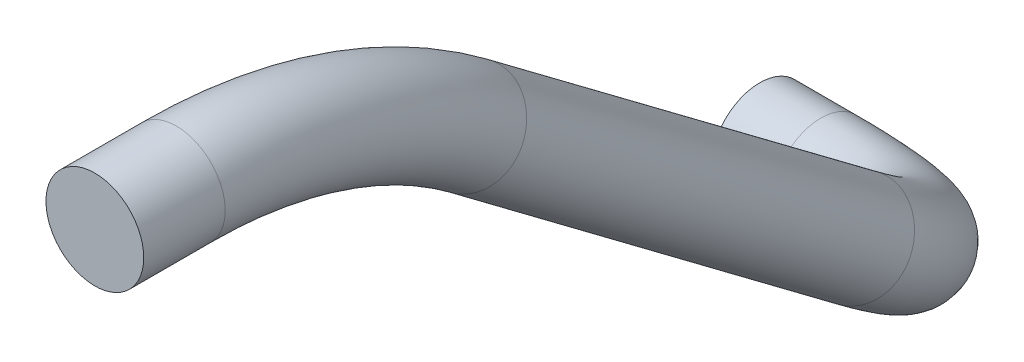
ISO-10303-21;
HEADER;
FILE_DESCRIPTION(('STEP AP214'),'2;1');
FILE_NAME('part.step','',(''),(''),'','','');
FILE_SCHEMA(('AUTOMOTIVE_DESIGN { 1 0 10303 214 1 1 1 1 }'));
ENDSEC;
DATA;
#1=APPLICATION_CONTEXT('core data for automotive mechanical design processes');
#2=APPLICATION_PROTOCOL_DEFINITION('international standard','automotive_design',2000,#1);
#3=PRODUCT_CONTEXT('',#1,'mechanical');
#4=PRODUCT('Part','Part','',(#3));
#5=PRODUCT_RELATED_PRODUCT_CATEGORY('part','',(#4));
#6=PRODUCT_DEFINITION_FORMATION('','',#4);
#7=PRODUCT_DEFINITION_CONTEXT('part definition',#1,'design');
#8=PRODUCT_DEFINITION('design','',#6,#7);
#9=PRODUCT_DEFINITION_SHAPE('','',#8);
#10=(LENGTH_UNIT() NAMED_UNIT(*) SI_UNIT(.MILLI.,.METRE.));
#11=(NAMED_UNIT(*) PLANE_ANGLE_UNIT() SI_UNIT($,.RADIAN.));
#12=(NAMED_UNIT(*) SI_UNIT($,.STERADIAN.) SOLID_ANGLE_UNIT());
#13=UNCERTAINTY_MEASURE_WITH_UNIT(LENGTH_MEASURE(1.E-05),#10,'distance_accuracy_value','');
#14=(GEOMETRIC_REPRESENTATION_CONTEXT(3) GLOBAL_UNCERTAINTY_ASSIGNED_CONTEXT((#13)) GLOBAL_UNIT_ASSIGNED_CONTEXT((#10,
#11,#12)) REPRESENTATION_CONTEXT('',''));
#15=CARTESIAN_POINT('',(0.,0.,0.));
#16=DIRECTION('',(0.,0.,1.));
#17=DIRECTION('',(1.,0.,0.));
#18=AXIS2_PLACEMENT_3D('',#15,#16,#17);
#19=CARTESIAN_POINT('',(0.,0.,0.));
#20=DIRECTION('',(0.,0.,1.));
#21=DIRECTION('',(1.,0.,0.));
#22=AXIS2_PLACEMENT_3D('',#19,#20,#21);
#23=PLANE('',#22);
#24=CARTESIAN_POINT('',(0.,0.,0.));
#25=DIRECTION('',(0.,0.,1.));
#26=DIRECTION('',(1.,0.,0.));
#27=AXIS2_PLACEMENT_3D('',#24,#25,#26);
#28=CIRCLE('',#27,4.);
#29=CARTESIAN_POINT('',(4.,0.,0.));
#30=VERTEX_POINT('',#29);
#31=EDGE_CURVE('E54',#30,#30,#28,.T.);
#32=ORIENTED_EDGE('',*,*,#31,.T.);
#33=EDGE_LOOP('',(#32));
#34=FACE_BOUND('',#33,.T.);
#35=ADVANCED_FACE('F42',(#34),#23,.T.);
#36=CARTESIAN_POINT('',(0.,0.,0.));
#37=DIRECTION('',(0.,0.,-1.));
#38=DIRECTION('',(-1.,0.,0.));
#39=AXIS2_PLACEMENT_3D('',#36,#37,#38);
#40=CYLINDRICAL_SURFACE('',#39,4.);
#41=CARTESIAN_POINT('',(0.,0.,-6.66666666666667));
#42=DIRECTION('',(0.,0.,1.));
#43=DIRECTION('',(1.,0.,0.));
#44=AXIS2_PLACEMENT_3D('',#41,#42,#43);
#45=CIRCLE('',#44,4.);
#46=CARTESIAN_POINT('',(0.,4.,-6.66666666666667));
#47=VERTEX_POINT('',#46);
#48=EDGE_CURVE('E49',#47,#47,#45,.T.);
#49=ORIENTED_EDGE('',*,*,#48,.T.);
#50=EDGE_LOOP('',(#49));
#51=FACE_BOUND('',#50,.T.);
#52=ORIENTED_EDGE('',*,*,#31,.F.);
#53=EDGE_LOOP('',(#52));
#54=FACE_BOUND('',#53,.T.);
#55=ADVANCED_FACE('F96',(#51,#54),#40,.T.);
#56=CARTESIAN_POINT('',(0.,-40.,-6.66666666666667));
#57=DIRECTION('',(-1.,0.,0.));
#58=DIRECTION('',(0.,0.,1.));
#59=AXIS2_PLACEMENT_3D('',#56,#57,#58);
#60=TOROIDAL_SURFACE('',#59,40.,4.);
#61=CARTESIAN_POINT('',(0.,-8.,-30.6666666666667));
#62=DIRECTION('',(0.,0.6,0.8));
#63=DIRECTION('',(1.,0.,0.));
#64=AXIS2_PLACEMENT_3D('',#61,#62,#63);
#65=CIRCLE('',#64,4.);
#66=CARTESIAN_POINT('',(0.,-4.8,-33.0666666666667));
#67=VERTEX_POINT('',#66);
#68=EDGE_CURVE('E11',#67,#67,#65,.T.);
#69=CARTESIAN_POINT('',(0.,-40.,-6.66666666666667));
#70=DIRECTION('',(-1.,0.,0.));
#71=DIRECTION('',(0.,0.,1.));
#72=AXIS2_PLACEMENT_3D('',#69,#70,#71);
#73=CIRCLE('',#72,44.);
#74=EDGE_CURVE('',#47,#67,#73,.T.);
#75=ORIENTED_EDGE('',*,*,#48,.F.);
#76=ORIENTED_EDGE('',*,*,#68,.T.);
#77=ORIENTED_EDGE('',*,*,#74,.T.);
#78=ORIENTED_EDGE('',*,*,#74,.F.);
#79=EDGE_LOOP('',(#75,#77,#76,#78));
#80=FACE_BOUND('',#79,.T.);
#81=ADVANCED_FACE('F91',(#80),#60,.T.);
#82=CARTESIAN_POINT('',(0.,-8.00000000000001,-30.6666666666667));
#83=DIRECTION('',(0.,-0.6,-0.8));
#84=DIRECTION('',(0.,0.8,-0.6));
#85=AXIS2_PLACEMENT_3D('',#82,#83,#84);
#86=CYLINDRICAL_SURFACE('',#85,4.);
#87=ORIENTED_EDGE('',*,*,#68,.F.);
#88=EDGE_LOOP('',(#87));
#89=FACE_BOUND('',#88,.T.);
#90=CARTESIAN_POINT('',(0.,-31.8,-62.4));
#91=DIRECTION('',(0.,0.6,0.8));
#92=DIRECTION('',(0.,-0.8,0.6));
#93=AXIS2_PLACEMENT_3D('',#90,#91,#92);
#94=CIRCLE('',#93,4.);
#95=CARTESIAN_POINT('',(4.00000000000001,-31.8,-62.4));
#96=VERTEX_POINT('',#95);
#97=EDGE_CURVE('E69',#96,#96,#94,.T.);
#98=ORIENTED_EDGE('',*,*,#97,.T.);
#99=EDGE_LOOP('',(#98));
#100=FACE_BOUND('',#99,.T.);
#101=ADVANCED_FACE('F74',(#89,#100),#86,.T.);
#102=CARTESIAN_POINT('',(-20.,-40.8,-74.4));
#103=DIRECTION('',(1.,0.,0.));
#104=DIRECTION('',(0.,-0.8,0.6));
#105=AXIS2_PLACEMENT_3D('',#102,#103,#104);
#106=PLANE('',#105);
#107=CARTESIAN_POINT('',(-20.,-40.8,-74.4));
#108=DIRECTION('',(1.,0.,0.));
#109=DIRECTION('',(0.,-0.8,0.6));
#110=AXIS2_PLACEMENT_3D('',#107,#108,#109);
#111=CIRCLE('',#110,4.);
#112=CARTESIAN_POINT('',(-20.,-44.,-72.));
#113=VERTEX_POINT('',#112);
#114=EDGE_CURVE('E59',#113,#113,#111,.T.);
#115=ORIENTED_EDGE('',*,*,#114,.F.);
#116=EDGE_LOOP('',(#115));
#117=FACE_BOUND('',#116,.T.);
#118=ADVANCED_FACE('F79',(#117),#106,.F.);
#119=CARTESIAN_POINT('',(-15.,-31.8000000000001,-62.3999999999999));
#120=DIRECTION('',(0.,0.8,-0.6));
#121=DIRECTION('',(0.,0.6,0.8));
#122=AXIS2_PLACEMENT_3D('',#119,#120,#121);
#123=TOROIDAL_SURFACE('',#122,15.,4.);
#124=CARTESIAN_POINT('',(-15.,-40.8,-74.4));
#125=DIRECTION('',(1.,0.,0.));
#126=DIRECTION('',(0.,-0.8,0.6));
#127=AXIS2_PLACEMENT_3D('',#124,#125,#126);
#128=CIRCLE('',#127,4.);
#129=CARTESIAN_POINT('',(-15.,-43.2,-77.6));
#130=VERTEX_POINT('',#129);
#131=EDGE_CURVE('E65',#130,#130,#128,.T.);
#132=CARTESIAN_POINT('',(-15.,-31.8000000000001,-62.3999999999999));
#133=DIRECTION('',(0.,0.8,-0.6));
#134=DIRECTION('',(0.,0.6,0.8));
#135=AXIS2_PLACEMENT_3D('',#132,#133,#134);
#136=CIRCLE('',#135,19.);
#137=EDGE_CURVE('',#96,#130,#136,.T.);
#138=ORIENTED_EDGE('',*,*,#97,.F.);
#139=ORIENTED_EDGE('',*,*,#131,.T.);
#140=ORIENTED_EDGE('',*,*,#137,.T.);
#141=ORIENTED_EDGE('',*,*,#137,.F.);
#142=EDGE_LOOP('',(#138,#140,#139,#141));
#143=FACE_BOUND('',#142,.T.);
#144=ADVANCED_FACE('F76',(#143),#123,.T.);
#145=CARTESIAN_POINT('',(-15.,-40.8,-74.4));
#146=DIRECTION('',(-1.,0.,0.));
#147=DIRECTION('',(0.,0.,1.));
#148=AXIS2_PLACEMENT_3D('',#145,#146,#147);
#149=CYLINDRICAL_SURFACE('',#148,4.);
#150=ORIENTED_EDGE('',*,*,#114,.T.);
#151=EDGE_LOOP('',(#150));
#152=FACE_BOUND('',#151,.T.);
#153=ORIENTED_EDGE('',*,*,#131,.F.);
#154=EDGE_LOOP('',(#153));
#155=FACE_BOUND('',#154,.T.);
#156=ADVANCED_FACE('F78',(#152,#155),#149,.T.);
#157=CLOSED_SHELL('',(#35,#55,#81,#101,#118,#144,#156));
#158=MANIFOLD_SOLID_BREP('B2',#157);
#159=ADVANCED_BREP_SHAPE_REPRESENTATION('',(#18,#158),#14);
#160=SHAPE_DEFINITION_REPRESENTATION(#9,#159);
ENDSEC;
END-ISO-10303-21;
